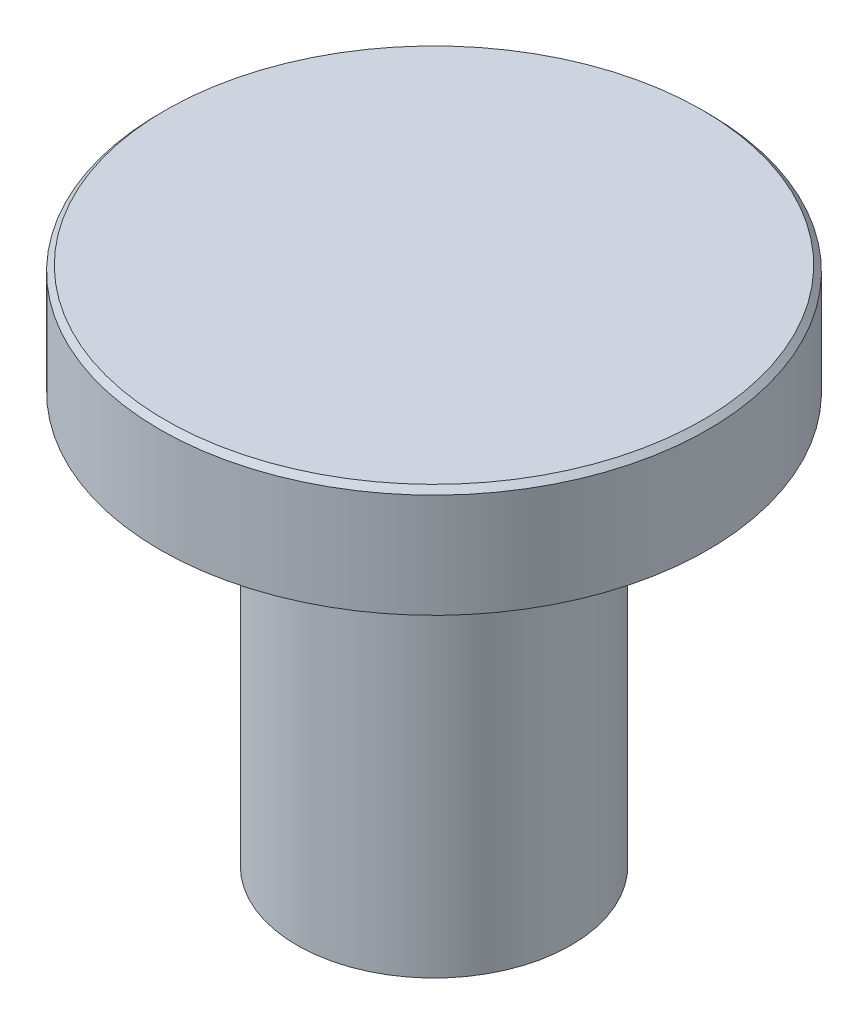
ISO-10303-21;
HEADER;
FILE_DESCRIPTION(('STEP AP214'),'2;1');
FILE_NAME('part.step','',(''),(''),'','','');
FILE_SCHEMA(('AUTOMOTIVE_DESIGN { 1 0 10303 214 1 1 1 1 }'));
ENDSEC;
DATA;
#1=APPLICATION_CONTEXT('core data for automotive mechanical design processes');
#2=APPLICATION_PROTOCOL_DEFINITION('international standard','automotive_design',2000,#1);
#3=PRODUCT_CONTEXT('',#1,'mechanical');
#4=PRODUCT('Part','Part','',(#3));
#5=PRODUCT_RELATED_PRODUCT_CATEGORY('part','',(#4));
#6=PRODUCT_DEFINITION_FORMATION('','',#4);
#7=PRODUCT_DEFINITION_CONTEXT('part definition',#1,'design');
#8=PRODUCT_DEFINITION('design','',#6,#7);
#9=PRODUCT_DEFINITION_SHAPE('','',#8);
#10=(LENGTH_UNIT() NAMED_UNIT(*) SI_UNIT(.MILLI.,.METRE.));
#11=(NAMED_UNIT(*) PLANE_ANGLE_UNIT() SI_UNIT($,.RADIAN.));
#12=(NAMED_UNIT(*) SI_UNIT($,.STERADIAN.) SOLID_ANGLE_UNIT());
#13=UNCERTAINTY_MEASURE_WITH_UNIT(LENGTH_MEASURE(1.E-05),#10,'distance_accuracy_value','');
#14=(GEOMETRIC_REPRESENTATION_CONTEXT(3) GLOBAL_UNCERTAINTY_ASSIGNED_CONTEXT((#13)) GLOBAL_UNIT_ASSIGNED_CONTEXT((#10,
#11,#12)) REPRESENTATION_CONTEXT('',''));
#15=CARTESIAN_POINT('',(0.,0.,0.));
#16=DIRECTION('',(0.,0.,1.));
#17=DIRECTION('',(1.,0.,0.));
#18=AXIS2_PLACEMENT_3D('',#15,#16,#17);
#19=CARTESIAN_POINT('',(-5.06,0.,-5.06));
#20=DIRECTION('',(0.,1.,0.));
#21=DIRECTION('',(0.,0.,1.));
#22=AXIS2_PLACEMENT_3D('',#19,#20,#21);
#23=PLANE('',#22);
#24=CARTESIAN_POINT('',(0.,0.,0.));
#25=DIRECTION('',(0.,-1.,0.));
#26=DIRECTION('',(1.,0.,0.));
#27=AXIS2_PLACEMENT_3D('',#24,#25,#26);
#28=CIRCLE('',#27,5.);
#29=CARTESIAN_POINT('',(5.,0.,0.));
#30=VERTEX_POINT('',#29);
#31=EDGE_CURVE('E18',#30,#30,#28,.T.);
#32=ORIENTED_EDGE('',*,*,#31,.T.);
#33=EDGE_LOOP('',(#32));
#34=FACE_BOUND('',#33,.T.);
#35=ADVANCED_FACE('F14',(#34),#23,.F.);
#36=CARTESIAN_POINT('',(0.,15.,0.));
#37=DIRECTION('',(0.,-1.,0.));
#38=DIRECTION('',(1.,0.,0.));
#39=AXIS2_PLACEMENT_3D('',#36,#37,#38);
#40=CYLINDRICAL_SURFACE('',#39,5.);
#41=CARTESIAN_POINT('',(0.,15.,0.));
#42=DIRECTION('',(0.,-1.,0.));
#43=DIRECTION('',(1.,0.,0.));
#44=AXIS2_PLACEMENT_3D('',#41,#42,#43);
#45=CIRCLE('',#44,5.);
#46=CARTESIAN_POINT('',(5.,15.,0.));
#47=VERTEX_POINT('',#46);
#48=EDGE_CURVE('E31',#47,#47,#45,.T.);
#49=ORIENTED_EDGE('',*,*,#48,.T.);
#50=EDGE_LOOP('',(#49));
#51=FACE_BOUND('',#50,.T.);
#52=ORIENTED_EDGE('',*,*,#31,.F.);
#53=EDGE_LOOP('',(#52));
#54=FACE_BOUND('',#53,.T.);
#55=ADVANCED_FACE('F39',(#51,#54),#40,.T.);
#56=CARTESIAN_POINT('',(-10.12,15.,-10.12));
#57=DIRECTION('',(0.,1.,0.));
#58=DIRECTION('',(0.,0.,1.));
#59=AXIS2_PLACEMENT_3D('',#56,#57,#58);
#60=PLANE('',#59);
#61=ORIENTED_EDGE('',*,*,#48,.F.);
#62=EDGE_LOOP('',(#61));
#63=FACE_BOUND('',#62,.T.);
#64=CARTESIAN_POINT('',(0.,15.,0.));
#65=DIRECTION('',(0.,-1.,0.));
#66=DIRECTION('',(0.,0.,-1.));
#67=AXIS2_PLACEMENT_3D('',#64,#65,#66);
#68=CIRCLE('',#67,10.);
#69=CARTESIAN_POINT('',(0.,15.,-10.));
#70=VERTEX_POINT('',#69);
#71=EDGE_CURVE('E27',#70,#70,#68,.T.);
#72=ORIENTED_EDGE('',*,*,#71,.T.);
#73=EDGE_LOOP('',(#72));
#74=FACE_BOUND('',#73,.T.);
#75=ADVANCED_FACE('F41',(#63,#74),#60,.F.);
#76=CARTESIAN_POINT('',(0.,18.8,0.));
#77=DIRECTION('',(0.,-1.,0.));
#78=DIRECTION('',(0.,0.,-1.));
#79=AXIS2_PLACEMENT_3D('',#76,#77,#78);
#80=CYLINDRICAL_SURFACE('',#79,10.);
#81=ORIENTED_EDGE('',*,*,#71,.F.);
#82=EDGE_LOOP('',(#81));
#83=FACE_BOUND('',#82,.T.);
#84=CARTESIAN_POINT('',(0.,18.7999999999999,0.));
#85=DIRECTION('',(0.,-1.,0.));
#86=DIRECTION('',(0.,0.,-1.));
#87=AXIS2_PLACEMENT_3D('',#84,#85,#86);
#88=CIRCLE('',#87,10.);
#89=CARTESIAN_POINT('',(0.,18.8,-10.));
#90=VERTEX_POINT('',#89);
#91=EDGE_CURVE('E22',#90,#90,#88,.T.);
#92=ORIENTED_EDGE('',*,*,#91,.T.);
#93=EDGE_LOOP('',(#92));
#94=FACE_BOUND('',#93,.T.);
#95=ADVANCED_FACE('F48',(#83,#94),#80,.T.);
#96=CARTESIAN_POINT('',(-9.9176,19.,-9.9176));
#97=DIRECTION('',(0.,1.,0.));
#98=DIRECTION('',(0.,0.,1.));
#99=AXIS2_PLACEMENT_3D('',#96,#97,#98);
#100=PLANE('',#99);
#101=CARTESIAN_POINT('',(0.,18.9999999999999,0.));
#102=DIRECTION('',(0.,-1.,0.));
#103=DIRECTION('',(0.,0.,-1.));
#104=AXIS2_PLACEMENT_3D('',#101,#102,#103);
#105=CIRCLE('',#104,9.80000000000009);
#106=CARTESIAN_POINT('',(0.,18.9999999999999,-9.80000000000009));
#107=VERTEX_POINT('',#106);
#108=EDGE_CURVE('E10',#107,#107,#105,.F.);
#109=ORIENTED_EDGE('',*,*,#108,.T.);
#110=EDGE_LOOP('',(#109));
#111=FACE_BOUND('',#110,.T.);
#112=ADVANCED_FACE('F16',(#111),#100,.T.);
#113=CARTESIAN_POINT('',(0.,19.,0.));
#114=DIRECTION('',(0.,-1.,0.));
#115=DIRECTION('',(0.,0.,-1.));
#116=AXIS2_PLACEMENT_3D('',#113,#114,#115);
#117=CONICAL_SURFACE('',#116,9.8,0.785398163397448);
#118=ORIENTED_EDGE('',*,*,#108,.F.);
#119=EDGE_LOOP('',(#118));
#120=FACE_BOUND('',#119,.T.);
#121=ORIENTED_EDGE('',*,*,#91,.F.);
#122=EDGE_LOOP('',(#121));
#123=FACE_BOUND('',#122,.T.);
#124=ADVANCED_FACE('F52',(#120,#123),#117,.T.);
#125=CLOSED_SHELL('',(#35,#55,#75,#95,#112,#124));
#126=MANIFOLD_SOLID_BREP('B1',#125);
#127=ADVANCED_BREP_SHAPE_REPRESENTATION('',(#18,#126),#14);
#128=SHAPE_DEFINITION_REPRESENTATION(#9,#127);
ENDSEC;
END-ISO-10303-21;
